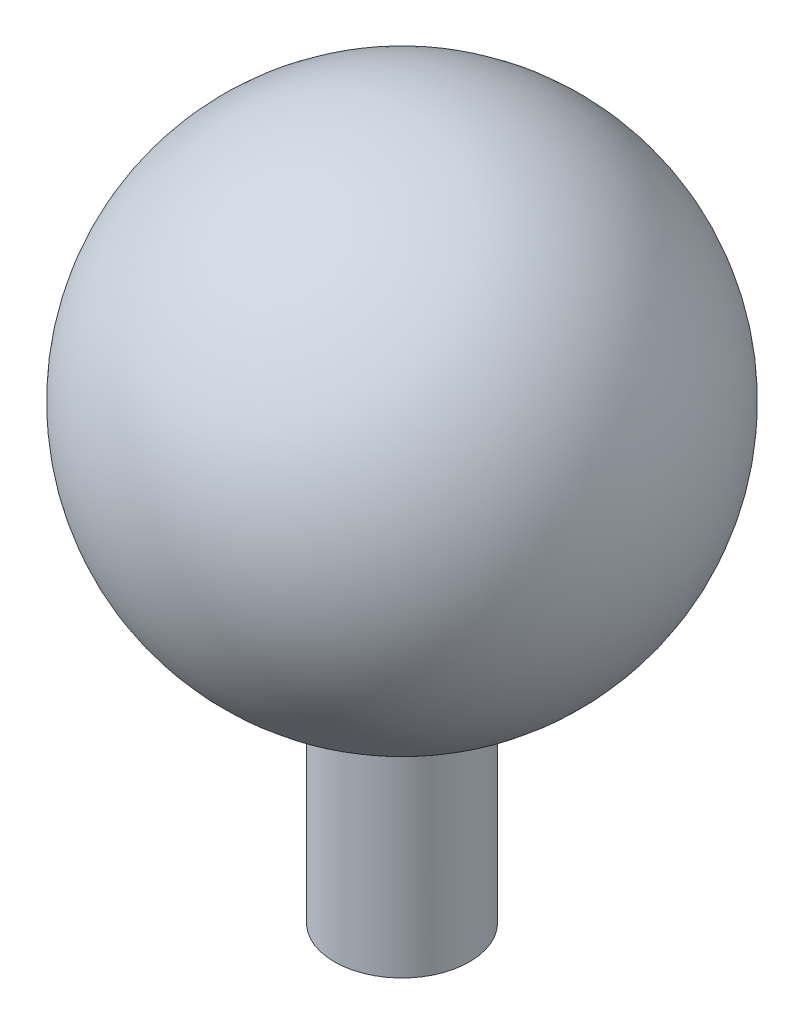
ISO-10303-21;
HEADER;
FILE_DESCRIPTION(('STEP AP214'),'2;1');
FILE_NAME('part.step','',(''),(''),'','','');
FILE_SCHEMA(('AUTOMOTIVE_DESIGN { 1 0 10303 214 1 1 1 1 }'));
ENDSEC;
DATA;
#1=APPLICATION_CONTEXT('core data for automotive mechanical design processes');
#2=APPLICATION_PROTOCOL_DEFINITION('international standard','automotive_design',2000,#1);
#3=PRODUCT_CONTEXT('',#1,'mechanical');
#4=PRODUCT('Part','Part','',(#3));
#5=PRODUCT_RELATED_PRODUCT_CATEGORY('part','',(#4));
#6=PRODUCT_DEFINITION_FORMATION('','',#4);
#7=PRODUCT_DEFINITION_CONTEXT('part definition',#1,'design');
#8=PRODUCT_DEFINITION('design','',#6,#7);
#9=PRODUCT_DEFINITION_SHAPE('','',#8);
#10=(LENGTH_UNIT() NAMED_UNIT(*) SI_UNIT(.MILLI.,.METRE.));
#11=(NAMED_UNIT(*) PLANE_ANGLE_UNIT() SI_UNIT($,.RADIAN.));
#12=(NAMED_UNIT(*) SI_UNIT($,.STERADIAN.) SOLID_ANGLE_UNIT());
#13=UNCERTAINTY_MEASURE_WITH_UNIT(LENGTH_MEASURE(1.E-05),#10,'distance_accuracy_value','');
#14=(GEOMETRIC_REPRESENTATION_CONTEXT(3) GLOBAL_UNCERTAINTY_ASSIGNED_CONTEXT((#13)) GLOBAL_UNIT_ASSIGNED_CONTEXT((#10,
#11,#12)) REPRESENTATION_CONTEXT('',''));
#15=CARTESIAN_POINT('',(0.,0.,0.));
#16=DIRECTION('',(0.,0.,1.));
#17=DIRECTION('',(1.,0.,0.));
#18=AXIS2_PLACEMENT_3D('',#15,#16,#17);
#19=CARTESIAN_POINT('',(0.,0.,0.));
#20=DIRECTION('',(0.,1.,0.));
#21=DIRECTION('',(1.,0.,0.));
#22=AXIS2_PLACEMENT_3D('',#19,#20,#21);
#23=SPHERICAL_SURFACE('',#22,20.);
#24=CARTESIAN_POINT('',(0.,-19.2637488430614,0.));
#25=DIRECTION('',(0.,1.,0.));
#26=DIRECTION('',(0.,0.,1.));
#27=AXIS2_PLACEMENT_3D('',#24,#25,#26);
#28=CIRCLE('',#27,5.37661422378914);
#29=CARTESIAN_POINT('',(0.,-19.2637488430614,5.37661422378914));
#30=VERTEX_POINT('',#29);
#31=EDGE_CURVE('E10',#30,#30,#28,.F.);
#32=ORIENTED_EDGE('',*,*,#31,.F.);
#33=EDGE_LOOP('',(#32));
#34=FACE_BOUND('',#33,.T.);
#35=ADVANCED_FACE('F31',(#34),#23,.T.);
#36=CARTESIAN_POINT('',(0.,0.,0.));
#37=DIRECTION('',(0.,1.,0.));
#38=DIRECTION('',(0.,0.,1.));
#39=AXIS2_PLACEMENT_3D('',#36,#37,#38);
#40=CYLINDRICAL_SURFACE('',#39,5.37661422378914);
#41=CARTESIAN_POINT('',(0.,-35.934134015311,0.));
#42=DIRECTION('',(0.,1.,0.));
#43=DIRECTION('',(0.,0.,1.));
#44=AXIS2_PLACEMENT_3D('',#41,#42,#43);
#45=CIRCLE('',#44,5.37661422378914);
#46=CARTESIAN_POINT('',(0.,-35.934134015311,5.37661422378914));
#47=VERTEX_POINT('',#46);
#48=EDGE_CURVE('E37',#47,#47,#45,.T.);
#49=ORIENTED_EDGE('',*,*,#48,.T.);
#50=EDGE_LOOP('',(#49));
#51=FACE_BOUND('',#50,.T.);
#52=ORIENTED_EDGE('',*,*,#31,.T.);
#53=EDGE_LOOP('',(#52));
#54=FACE_BOUND('',#53,.T.);
#55=ADVANCED_FACE('F43',(#51,#54),#40,.T.);
#56=CARTESIAN_POINT('',(0.,-35.934134015311,0.));
#57=DIRECTION('',(0.,1.,0.));
#58=DIRECTION('',(0.,0.,1.));
#59=AXIS2_PLACEMENT_3D('',#56,#57,#58);
#60=PLANE('',#59);
#61=ORIENTED_EDGE('',*,*,#48,.F.);
#62=EDGE_LOOP('',(#61));
#63=FACE_BOUND('',#62,.T.);
#64=ADVANCED_FACE('F45',(#63),#60,.F.);
#65=CLOSED_SHELL('',(#35,#55,#64));
#66=MANIFOLD_SOLID_BREP('B2',#65);
#67=ADVANCED_BREP_SHAPE_REPRESENTATION('',(#18,#66),#14);
#68=SHAPE_DEFINITION_REPRESENTATION(#9,#67);
ENDSEC;
END-ISO-10303-21;
